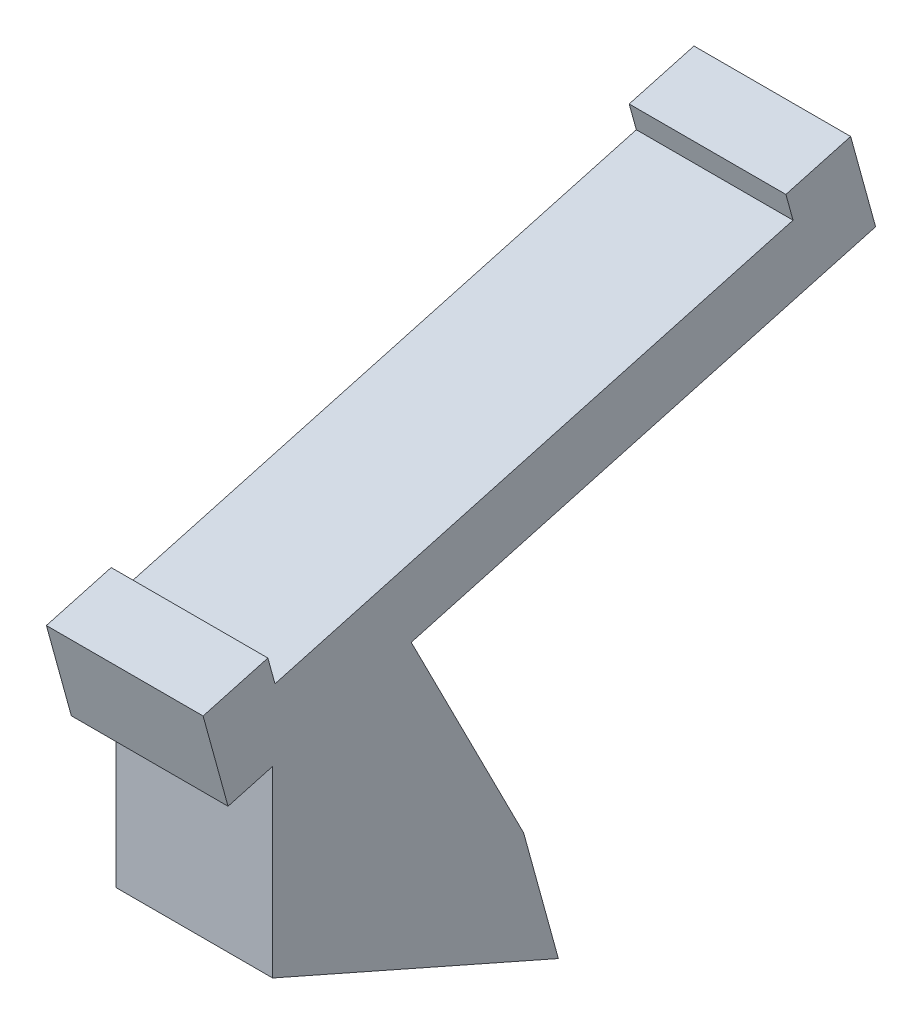
ISO-10303-21;
HEADER;
FILE_DESCRIPTION(('STEP AP214'),'2;1');
FILE_NAME('part.step','',(''),(''),'','','');
FILE_SCHEMA(('AUTOMOTIVE_DESIGN { 1 0 10303 214 1 1 1 1 }'));
ENDSEC;
DATA;
#1=APPLICATION_CONTEXT('core data for automotive mechanical design processes');
#2=APPLICATION_PROTOCOL_DEFINITION('international standard','automotive_design',2000,#1);
#3=PRODUCT_CONTEXT('',#1,'mechanical');
#4=PRODUCT('Part','Part','',(#3));
#5=PRODUCT_RELATED_PRODUCT_CATEGORY('part','',(#4));
#6=PRODUCT_DEFINITION_FORMATION('','',#4);
#7=PRODUCT_DEFINITION_CONTEXT('part definition',#1,'design');
#8=PRODUCT_DEFINITION('design','',#6,#7);
#9=PRODUCT_DEFINITION_SHAPE('','',#8);
#10=(LENGTH_UNIT() NAMED_UNIT(*) SI_UNIT(.MILLI.,.METRE.));
#11=(NAMED_UNIT(*) PLANE_ANGLE_UNIT() SI_UNIT($,.RADIAN.));
#12=(NAMED_UNIT(*) SI_UNIT($,.STERADIAN.) SOLID_ANGLE_UNIT());
#13=UNCERTAINTY_MEASURE_WITH_UNIT(LENGTH_MEASURE(1.E-05),#10,'distance_accuracy_value','');
#14=(GEOMETRIC_REPRESENTATION_CONTEXT(3) GLOBAL_UNCERTAINTY_ASSIGNED_CONTEXT((#13)) GLOBAL_UNIT_ASSIGNED_CONTEXT((#10,
#11,#12)) REPRESENTATION_CONTEXT('',''));
#15=CARTESIAN_POINT('',(0.,0.,0.));
#16=DIRECTION('',(0.,0.,1.));
#17=DIRECTION('',(1.,0.,0.));
#18=AXIS2_PLACEMENT_3D('',#15,#16,#17);
#19=CARTESIAN_POINT('',(-124.701519536903,9.08716043498502,7.80885771892847));
#20=DIRECTION('',(0.,-0.964200123104131,-0.26517564482052));
#21=DIRECTION('',(0.,0.26517564482052,-0.964200123104131));
#22=AXIS2_PLACEMENT_3D('',#19,#20,#21);
#23=PLANE('',#22);
#24=DIRECTION('',(1.,0.,0.));
#25=VECTOR('',#24,1.);
#26=CARTESIAN_POINT('',(-124.701519536903,9.48492390221582,6.36255753427228));
#27=LINE('',#26,#25);
#28=CARTESIAN_POINT('',(-121.201519536903,9.48492390221582,6.36255753427227));
#29=VERTEX_POINT('',#28);
#30=CARTESIAN_POINT('',(-124.701519536903,9.4849239022158,6.36255753427227));
#31=VERTEX_POINT('',#30);
#32=EDGE_CURVE('E162',#29,#31,#27,.F.);
#33=ORIENTED_EDGE('',*,*,#32,.T.);
#34=DIRECTION('',(0.,-0.26517564482052,0.964200123104131));
#35=VECTOR('',#34,1.);
#36=CARTESIAN_POINT('',(-124.701519536903,9.4849239022158,6.36255753427227));
#37=LINE('',#36,#35);
#38=CARTESIAN_POINT('',(-124.701519536903,9.08716043498502,7.80885771892847));
#39=VERTEX_POINT('',#38);
#40=EDGE_CURVE('E127',#31,#39,#37,.T.);
#41=ORIENTED_EDGE('',*,*,#40,.T.);
#42=DIRECTION('',(1.,0.,0.));
#43=VECTOR('',#42,1.);
#44=CARTESIAN_POINT('',(-124.701519536903,9.08716043498502,7.80885771892847));
#45=LINE('',#44,#43);
#46=CARTESIAN_POINT('',(-121.201519536903,9.08716043498504,7.80885771892847));
#47=VERTEX_POINT('',#46);
#48=EDGE_CURVE('E125',#39,#47,#45,.T.);
#49=ORIENTED_EDGE('',*,*,#48,.T.);
#50=DIRECTION('',(0.,0.26517564482052,-0.964200123104131));
#51=VECTOR('',#50,1.);
#52=CARTESIAN_POINT('',(-121.201519536903,9.08716043498504,7.80885771892848));
#53=LINE('',#52,#51);
#54=EDGE_CURVE('E20',#29,#47,#53,.F.);
#55=ORIENTED_EDGE('',*,*,#54,.F.);
#56=EDGE_LOOP('',(#33,#41,#49,#55));
#57=FACE_BOUND('',#56,.T.);
#58=ADVANCED_FACE('F17',(#57),#23,.F.);
#59=CARTESIAN_POINT('',(-124.701519536903,5.3265326232763,19.2201538092857));
#60=DIRECTION('',(0.,-0.26517564482052,0.964200123104131));
#61=DIRECTION('',(0.,-0.964200123104131,-0.26517564482052));
#62=AXIS2_PLACEMENT_3D('',#59,#60,#61);
#63=PLANE('',#62);
#64=DIRECTION('',(1.,0.,0.));
#65=VECTOR('',#64,1.);
#66=CARTESIAN_POINT('',(-124.701519536903,5.32653262327631,19.2201538092857));
#67=LINE('',#66,#65);
#68=CARTESIAN_POINT('',(-121.201519536903,5.32653262327631,19.2201538092857));
#69=VERTEX_POINT('',#68);
#70=CARTESIAN_POINT('',(-124.701519536903,5.3265326232763,19.2201538092857));
#71=VERTEX_POINT('',#70);
#72=EDGE_CURVE('E168',#69,#71,#67,.F.);
#73=ORIENTED_EDGE('',*,*,#72,.T.);
#74=DIRECTION('',(0.,0.964200123104137,0.2651756448205));
#75=VECTOR('',#74,1.);
#76=CARTESIAN_POINT('',(-124.701519536903,5.3265326232763,19.2201538092857));
#77=LINE('',#76,#75);
#78=CARTESIAN_POINT('',(-124.701519536903,5.90505269713879,19.379259196178));
#79=VERTEX_POINT('',#78);
#80=EDGE_CURVE('E146',#71,#79,#77,.T.);
#81=ORIENTED_EDGE('',*,*,#80,.T.);
#82=DIRECTION('',(1.,0.,0.));
#83=VECTOR('',#82,1.);
#84=CARTESIAN_POINT('',(-124.701519536903,5.90505269713878,19.379259196178));
#85=LINE('',#84,#83);
#86=CARTESIAN_POINT('',(-121.201519536903,5.9050526971388,19.379259196178));
#87=VERTEX_POINT('',#86);
#88=EDGE_CURVE('E135',#79,#87,#85,.T.);
#89=ORIENTED_EDGE('',*,*,#88,.T.);
#90=DIRECTION('',(0.,-0.964200123104131,-0.26517564482052));
#91=VECTOR('',#90,1.);
#92=CARTESIAN_POINT('',(-121.201519536903,5.3265326232763,19.2201538092857));
#93=LINE('',#92,#91);
#94=EDGE_CURVE('E109',#69,#87,#93,.F.);
#95=ORIENTED_EDGE('',*,*,#94,.F.);
#96=EDGE_LOOP('',(#73,#81,#89,#95));
#97=FACE_BOUND('',#96,.T.);
#98=ADVANCED_FACE('F245',(#97),#63,.F.);
#99=CARTESIAN_POINT('',(-124.701519536903,9.08716043498502,7.80885771892847));
#100=DIRECTION('',(0.,0.26517564482052,-0.964200123104131));
#101=DIRECTION('',(0.,0.964200123104131,0.26517564482052));
#102=AXIS2_PLACEMENT_3D('',#99,#100,#101);
#103=PLANE('',#102);
#104=ORIENTED_EDGE('',*,*,#48,.F.);
#105=DIRECTION('',(0.,-0.964200123104128,-0.265175644820532));
#106=VECTOR('',#105,1.);
#107=CARTESIAN_POINT('',(-124.701519536903,9.08716043498502,7.80885771892847));
#108=LINE('',#107,#106);
#109=CARTESIAN_POINT('',(-124.701519536903,8.50864036112255,7.64975233203615));
#110=VERTEX_POINT('',#109);
#111=EDGE_CURVE('E144',#39,#110,#108,.T.);
#112=ORIENTED_EDGE('',*,*,#111,.T.);
#113=DIRECTION('',(1.,0.,0.));
#114=VECTOR('',#113,1.);
#115=CARTESIAN_POINT('',(-124.701519536903,8.50864036112254,7.64975233203615));
#116=LINE('',#115,#114);
#117=CARTESIAN_POINT('',(-121.201519536903,8.50864036112257,7.64975233203616));
#118=VERTEX_POINT('',#117);
#119=EDGE_CURVE('E133',#110,#118,#116,.T.);
#120=ORIENTED_EDGE('',*,*,#119,.T.);
#121=DIRECTION('',(0.,0.964200123104131,0.26517564482052));
#122=VECTOR('',#121,1.);
#123=CARTESIAN_POINT('',(-121.201519536903,9.08716043498502,7.80885771892846));
#124=LINE('',#123,#122);
#125=EDGE_CURVE('E117',#47,#118,#124,.F.);
#126=ORIENTED_EDGE('',*,*,#125,.F.);
#127=EDGE_LOOP('',(#104,#112,#120,#126));
#128=FACE_BOUND('',#127,.T.);
#129=ADVANCED_FACE('F131',(#128),#103,.F.);
#130=CARTESIAN_POINT('',(-124.701519536903,5.90505269713878,19.379259196178));
#131=DIRECTION('',(0.,-0.964200123104131,-0.26517564482052));
#132=DIRECTION('',(0.,0.26517564482052,-0.964200123104131));
#133=AXIS2_PLACEMENT_3D('',#130,#131,#132);
#134=PLANE('',#133);
#135=ORIENTED_EDGE('',*,*,#88,.F.);
#136=DIRECTION('',(0.,-0.265175644820519,0.964200123104131));
#137=VECTOR('',#136,1.);
#138=CARTESIAN_POINT('',(-124.701519536903,5.90505269713878,19.379259196178));
#139=LINE('',#138,#137);
#140=CARTESIAN_POINT('',(-124.701519536903,5.507289229908,20.8255593808342));
#141=VERTEX_POINT('',#140);
#142=EDGE_CURVE('E148',#79,#141,#139,.T.);
#143=ORIENTED_EDGE('',*,*,#142,.T.);
#144=DIRECTION('',(1.,0.,0.));
#145=VECTOR('',#144,1.);
#146=CARTESIAN_POINT('',(-124.701519536903,5.507289229908,20.8255593808342));
#147=LINE('',#146,#145);
#148=CARTESIAN_POINT('',(-121.201519536903,5.50728922990802,20.8255593808342));
#149=VERTEX_POINT('',#148);
#150=EDGE_CURVE('E179',#141,#149,#147,.T.);
#151=ORIENTED_EDGE('',*,*,#150,.T.);
#152=DIRECTION('',(0.,0.26517564482052,-0.964200123104131));
#153=VECTOR('',#152,1.);
#154=CARTESIAN_POINT('',(-121.201519536903,5.9050526971388,19.379259196178));
#155=LINE('',#154,#153);
#156=EDGE_CURVE('E137',#87,#149,#155,.F.);
#157=ORIENTED_EDGE('',*,*,#156,.F.);
#158=EDGE_LOOP('',(#135,#143,#151,#157));
#159=FACE_BOUND('',#158,.T.);
#160=ADVANCED_FACE('F249',(#159),#134,.F.);
#161=CARTESIAN_POINT('',(-124.701519536903,3.75559879574455,19.275568362551));
#162=DIRECTION('',(0.,0.964200123104131,0.26517564482052));
#163=DIRECTION('',(0.,-0.26517564482052,0.964200123104131));
#164=AXIS2_PLACEMENT_3D('',#161,#162,#163);
#165=PLANE('',#164);
#166=DIRECTION('',(1.,0.,0.));
#167=VECTOR('',#166,1.);
#168=CARTESIAN_POINT('',(-124.701519536903,3.48246897138934,20.2686905267111));
#169=LINE('',#168,#167);
#170=CARTESIAN_POINT('',(-121.201519536903,3.48246897138935,20.2686905267111));
#171=VERTEX_POINT('',#170);
#172=CARTESIAN_POINT('',(-124.701519536903,3.48246897138933,20.2686905267111));
#173=VERTEX_POINT('',#172);
#174=EDGE_CURVE('E174',#171,#173,#169,.F.);
#175=ORIENTED_EDGE('',*,*,#174,.T.);
#176=DIRECTION('',(0.,0.265175644820536,-0.964200123104127));
#177=VECTOR('',#176,1.);
#178=CARTESIAN_POINT('',(-124.701519536903,3.48246897138932,20.2686905267111));
#179=LINE('',#178,#177);
#180=CARTESIAN_POINT('',(-124.701519536903,3.75559879574455,19.275568362551));
#181=VERTEX_POINT('',#180);
#182=EDGE_CURVE('E150',#173,#181,#179,.T.);
#183=ORIENTED_EDGE('',*,*,#182,.T.);
#184=DIRECTION('',(1.,0.,0.));
#185=VECTOR('',#184,1.);
#186=CARTESIAN_POINT('',(-124.701519536903,3.75559879574455,19.275568362551));
#187=LINE('',#186,#185);
#188=CARTESIAN_POINT('',(-121.201519536903,3.75559879574457,19.275568362551));
#189=VERTEX_POINT('',#188);
#190=EDGE_CURVE('E185',#181,#189,#187,.T.);
#191=ORIENTED_EDGE('',*,*,#190,.T.);
#192=DIRECTION('',(0.,-0.26517564482052,0.964200123104131));
#193=VECTOR('',#192,1.);
#194=CARTESIAN_POINT('',(-121.201519536903,3.75559879574457,19.275568362551));
#195=LINE('',#194,#193);
#196=EDGE_CURVE('E141',#171,#189,#195,.F.);
#197=ORIENTED_EDGE('',*,*,#196,.F.);
#198=EDGE_LOOP('',(#175,#183,#191,#197));
#199=FACE_BOUND('',#198,.T.);
#200=ADVANCED_FACE('F211',(#199),#165,.F.);
#201=CARTESIAN_POINT('',(-124.701519536903,5.97251631493882,16.8713047834039));
#202=DIRECTION('',(1.,0.,0.));
#203=DIRECTION('',(0.,0.,-1.));
#204=AXIS2_PLACEMENT_3D('',#201,#202,#203);
#205=PLANE('',#204);
#206=DIRECTION('',(0.,-0.964200123104131,-0.265175644820521));
#207=VECTOR('',#206,1.);
#208=CARTESIAN_POINT('',(-124.701519536903,-0.334062779495785,13.666249693641));
#209=LINE('',#208,#207);
#210=CARTESIAN_POINT('',(-124.701519536903,-0.334062779495782,13.666249693641));
#211=VERTEX_POINT('',#210);
#212=CARTESIAN_POINT('',(-124.701519536903,-3.15220352832829,12.8912007464776));
#213=VERTEX_POINT('',#212);
#214=EDGE_CURVE('E152',#211,#213,#209,.T.);
#215=ORIENTED_EDGE('',*,*,#214,.T.);
#216=DIRECTION('',(0.,0.40357362904015,0.91494717112157));
#217=VECTOR('',#216,1.);
#218=CARTESIAN_POINT('',(-124.701519536903,-3.15220352832829,12.8912007464776));
#219=LINE('',#218,#217);
#220=CARTESIAN_POINT('',(-124.701519536903,-0.33710530180183,19.2733475802924));
#221=VERTEX_POINT('',#220);
#222=EDGE_CURVE('E191',#213,#221,#219,.T.);
#223=ORIENTED_EDGE('',*,*,#222,.T.);
#224=DIRECTION('',(0.,0.999999852781912,0.00054261971516173));
#225=VECTOR('',#224,1.);
#226=CARTESIAN_POINT('',(-124.701519536903,-0.33710530180184,19.2733475802924));
#227=LINE('',#226,#225);
#228=EDGE_CURVE('E182',#221,#181,#227,.T.);
#229=ORIENTED_EDGE('',*,*,#228,.T.);
#230=ORIENTED_EDGE('',*,*,#182,.F.);
#231=DIRECTION('',(0.,0.964200123104131,0.26517564482052));
#232=VECTOR('',#231,1.);
#233=CARTESIAN_POINT('',(-124.701519536903,3.48246897138932,20.2686905267111));
#234=LINE('',#233,#232);
#235=EDGE_CURVE('E176',#173,#141,#234,.T.);
#236=ORIENTED_EDGE('',*,*,#235,.T.);
#237=ORIENTED_EDGE('',*,*,#142,.F.);
#238=ORIENTED_EDGE('',*,*,#80,.F.);
#239=DIRECTION('',(0.,0.26517564482052,-0.964200123104131));
#240=VECTOR('',#239,1.);
#241=CARTESIAN_POINT('',(-124.701519536903,8.50864036112254,7.64975233203615));
#242=LINE('',#241,#240);
#243=EDGE_CURVE('E170',#71,#110,#242,.T.);
#244=ORIENTED_EDGE('',*,*,#243,.T.);
#245=ORIENTED_EDGE('',*,*,#111,.F.);
#246=ORIENTED_EDGE('',*,*,#40,.F.);
#247=DIRECTION('',(0.,-0.964200123104131,-0.26517564482052));
#248=VECTOR('',#247,1.);
#249=CARTESIAN_POINT('',(-124.701519536903,9.4849239022158,6.36255753427227));
#250=LINE('',#249,#248);
#251=CARTESIAN_POINT('',(-124.701519536903,7.46010364369713,5.80568868014918));
#252=VERTEX_POINT('',#251);
#253=EDGE_CURVE('E164',#31,#252,#250,.T.);
#254=ORIENTED_EDGE('',*,*,#253,.T.);
#255=DIRECTION('',(0.,-0.26517564482052,0.964200123104131));
#256=VECTOR('',#255,1.);
#257=CARTESIAN_POINT('',(-124.701519536903,7.46010364369713,5.80568868014918));
#258=LINE('',#257,#256);
#259=CARTESIAN_POINT('',(-124.701519536903,4.60759513262601,16.1776406721653));
#260=VERTEX_POINT('',#259);
#261=EDGE_CURVE('E158',#252,#260,#258,.T.);
#262=ORIENTED_EDGE('',*,*,#261,.T.);
#263=DIRECTION('',(0.,-0.891481058843045,-0.453057967289047));
#264=VECTOR('',#263,1.);
#265=CARTESIAN_POINT('',(-124.701519536903,4.607595132626,16.1776406721653));
#266=LINE('',#265,#264);
#267=EDGE_CURVE('E154',#260,#211,#266,.T.);
#268=ORIENTED_EDGE('',*,*,#267,.T.);
#269=EDGE_LOOP('',(#215,#223,#229,#230,#236,#237,#238,#244,#245,#246,#254,#262,#268));
#270=FACE_BOUND('',#269,.T.);
#271=ADVANCED_FACE('F216',(#270),#205,.F.);
#272=CARTESIAN_POINT('',(-124.701519536903,-0.334062779495785,13.666249693641));
#273=DIRECTION('',(0.,-0.265175644820521,0.964200123104131));
#274=DIRECTION('',(0.,-0.964200123104131,-0.265175644820521));
#275=AXIS2_PLACEMENT_3D('',#272,#273,#274);
#276=PLANE('',#275);
#277=DIRECTION('',(1.,0.,0.));
#278=VECTOR('',#277,1.);
#279=CARTESIAN_POINT('',(-124.701519536903,-3.15220352832829,12.8912007464776));
#280=LINE('',#279,#278);
#281=CARTESIAN_POINT('',(-121.201519536903,-3.15220352832828,12.8912007464776));
#282=VERTEX_POINT('',#281);
#283=EDGE_CURVE('E188',#282,#213,#280,.F.);
#284=ORIENTED_EDGE('',*,*,#283,.T.);
#285=ORIENTED_EDGE('',*,*,#214,.F.);
#286=DIRECTION('',(1.,0.,0.));
#287=VECTOR('',#286,1.);
#288=CARTESIAN_POINT('',(-124.701519536903,-0.334062779495777,13.666249693641));
#289=LINE('',#288,#287);
#290=CARTESIAN_POINT('',(-121.201519536903,-0.334062779495762,13.666249693641));
#291=VERTEX_POINT('',#290);
#292=EDGE_CURVE('E156',#211,#291,#289,.T.);
#293=ORIENTED_EDGE('',*,*,#292,.T.);
#294=DIRECTION('',(0.,0.964200123104128,0.265175644820531));
#295=VECTOR('',#294,1.);
#296=CARTESIAN_POINT('',(-121.201519536903,-3.15220352832827,12.8912007464776));
#297=LINE('',#296,#295);
#298=EDGE_CURVE('E194',#282,#291,#297,.T.);
#299=ORIENTED_EDGE('',*,*,#298,.F.);
#300=EDGE_LOOP('',(#284,#285,#293,#299));
#301=FACE_BOUND('',#300,.T.);
#302=ADVANCED_FACE('F223',(#301),#276,.F.);
#303=CARTESIAN_POINT('',(-124.701519536903,4.607595132626,16.1776406721653));
#304=DIRECTION('',(0.,-0.453057967289047,0.891481058843045));
#305=DIRECTION('',(0.,-0.891481058843045,-0.453057967289047));
#306=AXIS2_PLACEMENT_3D('',#303,#304,#305);
#307=PLANE('',#306);
#308=ORIENTED_EDGE('',*,*,#292,.F.);
#309=ORIENTED_EDGE('',*,*,#267,.F.);
#310=DIRECTION('',(1.,0.,0.));
#311=VECTOR('',#310,1.);
#312=CARTESIAN_POINT('',(-124.701519536903,4.60759513262601,16.1776406721653));
#313=LINE('',#312,#311);
#314=CARTESIAN_POINT('',(-121.201519536903,4.60759513262603,16.1776406721653));
#315=VERTEX_POINT('',#314);
#316=EDGE_CURVE('E160',#260,#315,#313,.T.);
#317=ORIENTED_EDGE('',*,*,#316,.T.);
#318=DIRECTION('',(0.,0.891481058843047,0.453057967289044));
#319=VECTOR('',#318,1.);
#320=CARTESIAN_POINT('',(-121.201519536903,-0.33406277949576,13.666249693641));
#321=LINE('',#320,#319);
#322=EDGE_CURVE('E197',#291,#315,#321,.T.);
#323=ORIENTED_EDGE('',*,*,#322,.F.);
#324=EDGE_LOOP('',(#308,#309,#317,#323));
#325=FACE_BOUND('',#324,.T.);
#326=ADVANCED_FACE('F228',(#325),#307,.F.);
#327=CARTESIAN_POINT('',(-124.701519536903,7.46010364369713,5.80568868014918));
#328=DIRECTION('',(0.,0.964200123104131,0.26517564482052));
#329=DIRECTION('',(0.,-0.26517564482052,0.964200123104131));
#330=AXIS2_PLACEMENT_3D('',#327,#328,#329);
#331=PLANE('',#330);
#332=ORIENTED_EDGE('',*,*,#316,.F.);
#333=ORIENTED_EDGE('',*,*,#261,.F.);
#334=DIRECTION('',(1.,0.,0.));
#335=VECTOR('',#334,1.);
#336=CARTESIAN_POINT('',(-124.701519536903,7.46010364369713,5.80568868014918));
#337=LINE('',#336,#335);
#338=CARTESIAN_POINT('',(-121.201519536903,7.46010364369715,5.80568868014918));
#339=VERTEX_POINT('',#338);
#340=EDGE_CURVE('E166',#252,#339,#337,.T.);
#341=ORIENTED_EDGE('',*,*,#340,.T.);
#342=DIRECTION('',(0.,0.26517564482052,-0.964200123104131));
#343=VECTOR('',#342,1.);
#344=CARTESIAN_POINT('',(-121.201519536903,4.60759513262603,16.1776406721653));
#345=LINE('',#344,#343);
#346=EDGE_CURVE('E200',#315,#339,#345,.T.);
#347=ORIENTED_EDGE('',*,*,#346,.F.);
#348=EDGE_LOOP('',(#332,#333,#341,#347));
#349=FACE_BOUND('',#348,.T.);
#350=ADVANCED_FACE('F233',(#349),#331,.F.);
#351=CARTESIAN_POINT('',(-124.701519536903,9.4849239022158,6.36255753427227));
#352=DIRECTION('',(0.,-0.26517564482052,0.964200123104131));
#353=DIRECTION('',(0.,-0.964200123104131,-0.26517564482052));
#354=AXIS2_PLACEMENT_3D('',#351,#352,#353);
#355=PLANE('',#354);
#356=ORIENTED_EDGE('',*,*,#340,.F.);
#357=ORIENTED_EDGE('',*,*,#253,.F.);
#358=ORIENTED_EDGE('',*,*,#32,.F.);
#359=DIRECTION('',(0.,0.964200123104131,0.26517564482052));
#360=VECTOR('',#359,1.);
#361=CARTESIAN_POINT('',(-121.201519536903,7.46010364369715,5.80568868014918));
#362=LINE('',#361,#360);
#363=EDGE_CURVE('E121',#339,#29,#362,.T.);
#364=ORIENTED_EDGE('',*,*,#363,.F.);
#365=EDGE_LOOP('',(#356,#357,#358,#364));
#366=FACE_BOUND('',#365,.T.);
#367=ADVANCED_FACE('F237',(#366),#355,.F.);
#368=CARTESIAN_POINT('',(-124.701519536903,8.50864036112254,7.64975233203615));
#369=DIRECTION('',(0.,-0.964200123104131,-0.26517564482052));
#370=DIRECTION('',(0.,0.26517564482052,-0.964200123104131));
#371=AXIS2_PLACEMENT_3D('',#368,#369,#370);
#372=PLANE('',#371);
#373=ORIENTED_EDGE('',*,*,#119,.F.);
#374=ORIENTED_EDGE('',*,*,#243,.F.);
#375=ORIENTED_EDGE('',*,*,#72,.F.);
#376=DIRECTION('',(0.,-0.265175644820521,0.964200123104131));
#377=VECTOR('',#376,1.);
#378=CARTESIAN_POINT('',(-121.201519536903,8.50864036112257,7.64975233203615));
#379=LINE('',#378,#377);
#380=EDGE_CURVE('E203',#118,#69,#379,.T.);
#381=ORIENTED_EDGE('',*,*,#380,.F.);
#382=EDGE_LOOP('',(#373,#374,#375,#381));
#383=FACE_BOUND('',#382,.T.);
#384=ADVANCED_FACE('F243',(#383),#372,.F.);
#385=CARTESIAN_POINT('',(-124.701519536903,3.48246897138932,20.2686905267111));
#386=DIRECTION('',(0.,0.26517564482052,-0.964200123104131));
#387=DIRECTION('',(0.,0.964200123104131,0.26517564482052));
#388=AXIS2_PLACEMENT_3D('',#385,#386,#387);
#389=PLANE('',#388);
#390=ORIENTED_EDGE('',*,*,#150,.F.);
#391=ORIENTED_EDGE('',*,*,#235,.F.);
#392=ORIENTED_EDGE('',*,*,#174,.F.);
#393=DIRECTION('',(0.,-0.96420012310413,-0.265175644820523));
#394=VECTOR('',#393,1.);
#395=CARTESIAN_POINT('',(-121.201519536903,5.50728922990802,20.8255593808342));
#396=LINE('',#395,#394);
#397=EDGE_CURVE('E205',#149,#171,#396,.T.);
#398=ORIENTED_EDGE('',*,*,#397,.F.);
#399=EDGE_LOOP('',(#390,#391,#392,#398));
#400=FACE_BOUND('',#399,.T.);
#401=ADVANCED_FACE('F253',(#400),#389,.F.);
#402=CARTESIAN_POINT('',(-124.701519536903,-0.33710530180184,19.2733475802924));
#403=DIRECTION('',(0.,0.00054261971516173,-0.999999852781912));
#404=DIRECTION('',(0.,0.999999852781912,0.00054261971516173));
#405=AXIS2_PLACEMENT_3D('',#402,#403,#404);
#406=PLANE('',#405);
#407=ORIENTED_EDGE('',*,*,#190,.F.);
#408=ORIENTED_EDGE('',*,*,#228,.F.);
#409=DIRECTION('',(1.,0.,0.));
#410=VECTOR('',#409,1.);
#411=CARTESIAN_POINT('',(-124.701519536903,-0.337105301801824,19.2733475802924));
#412=LINE('',#411,#410);
#413=CARTESIAN_POINT('',(-121.201519536903,-0.337105301801812,19.2733475802924));
#414=VERTEX_POINT('',#413);
#415=EDGE_CURVE('E35',#221,#414,#412,.T.);
#416=ORIENTED_EDGE('',*,*,#415,.T.);
#417=DIRECTION('',(0.,-0.999999852781911,-0.000542619715164454));
#418=VECTOR('',#417,1.);
#419=CARTESIAN_POINT('',(-121.201519536903,3.75559879574458,19.275568362551));
#420=LINE('',#419,#418);
#421=EDGE_CURVE('E26',#189,#414,#420,.T.);
#422=ORIENTED_EDGE('',*,*,#421,.F.);
#423=EDGE_LOOP('',(#407,#408,#416,#422));
#424=FACE_BOUND('',#423,.T.);
#425=ADVANCED_FACE('F209',(#424),#406,.F.);
#426=CARTESIAN_POINT('',(-124.701519536903,-3.15220352832829,12.8912007464776));
#427=DIRECTION('',(0.,0.91494717112157,-0.40357362904015));
#428=DIRECTION('',(0.,0.40357362904015,0.91494717112157));
#429=AXIS2_PLACEMENT_3D('',#426,#427,#428);
#430=PLANE('',#429);
#431=ORIENTED_EDGE('',*,*,#415,.F.);
#432=ORIENTED_EDGE('',*,*,#222,.F.);
#433=ORIENTED_EDGE('',*,*,#283,.F.);
#434=DIRECTION('',(0.,-0.403573629040148,-0.914947171121571));
#435=VECTOR('',#434,1.);
#436=CARTESIAN_POINT('',(-121.201519536903,-0.337105301801815,19.2733475802924));
#437=LINE('',#436,#435);
#438=EDGE_CURVE('E11',#414,#282,#437,.T.);
#439=ORIENTED_EDGE('',*,*,#438,.F.);
#440=EDGE_LOOP('',(#431,#432,#433,#439));
#441=FACE_BOUND('',#440,.T.);
#442=ADVANCED_FACE('F221',(#441),#430,.F.);
#443=CARTESIAN_POINT('',(-121.201519536903,5.97251631493884,16.8713047834039));
#444=DIRECTION('',(1.,0.,0.));
#445=DIRECTION('',(0.,0.,-1.));
#446=AXIS2_PLACEMENT_3D('',#443,#444,#445);
#447=PLANE('',#446);
#448=ORIENTED_EDGE('',*,*,#421,.T.);
#449=ORIENTED_EDGE('',*,*,#438,.T.);
#450=ORIENTED_EDGE('',*,*,#298,.T.);
#451=ORIENTED_EDGE('',*,*,#322,.T.);
#452=ORIENTED_EDGE('',*,*,#346,.T.);
#453=ORIENTED_EDGE('',*,*,#363,.T.);
#454=ORIENTED_EDGE('',*,*,#54,.T.);
#455=ORIENTED_EDGE('',*,*,#125,.T.);
#456=ORIENTED_EDGE('',*,*,#380,.T.);
#457=ORIENTED_EDGE('',*,*,#94,.T.);
#458=ORIENTED_EDGE('',*,*,#156,.T.);
#459=ORIENTED_EDGE('',*,*,#397,.T.);
#460=ORIENTED_EDGE('',*,*,#196,.T.);
#461=EDGE_LOOP('',(#448,#449,#450,#451,#452,#453,#454,#455,#456,#457,#458,#459,#460));
#462=FACE_BOUND('',#461,.T.);
#463=ADVANCED_FACE('F115',(#462),#447,.T.);
#464=CLOSED_SHELL('',(#58,#98,#129,#160,#200,#271,#302,#326,#350,#367,#384,#401,#425,#442,#463));
#465=MANIFOLD_SOLID_BREP('B1',#464);
#466=ADVANCED_BREP_SHAPE_REPRESENTATION('',(#18,#465),#14);
#467=SHAPE_DEFINITION_REPRESENTATION(#9,#466);
ENDSEC;
END-ISO-10303-21;
